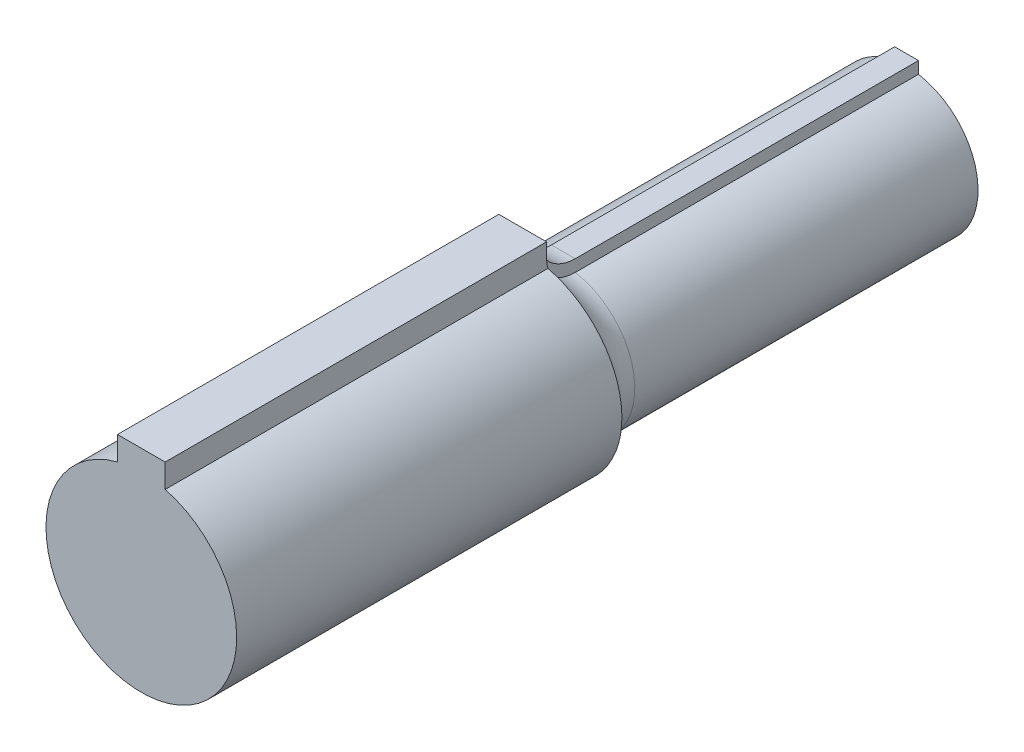
ISO-10303-21;
HEADER;
FILE_DESCRIPTION(('STEP AP214'),'2;1');
FILE_NAME('part.step','',(''),(''),'','','');
FILE_SCHEMA(('AUTOMOTIVE_DESIGN { 1 0 10303 214 1 1 1 1 }'));
ENDSEC;
DATA;
#1=APPLICATION_CONTEXT('core data for automotive mechanical design processes');
#2=APPLICATION_PROTOCOL_DEFINITION('international standard','automotive_design',2000,#1);
#3=PRODUCT_CONTEXT('',#1,'mechanical');
#4=PRODUCT('Part','Part','',(#3));
#5=PRODUCT_RELATED_PRODUCT_CATEGORY('part','',(#4));
#6=PRODUCT_DEFINITION_FORMATION('','',#4);
#7=PRODUCT_DEFINITION_CONTEXT('part definition',#1,'design');
#8=PRODUCT_DEFINITION('design','',#6,#7);
#9=PRODUCT_DEFINITION_SHAPE('','',#8);
#10=(LENGTH_UNIT() NAMED_UNIT(*) SI_UNIT(.MILLI.,.METRE.));
#11=(NAMED_UNIT(*) PLANE_ANGLE_UNIT() SI_UNIT($,.RADIAN.));
#12=(NAMED_UNIT(*) SI_UNIT($,.STERADIAN.) SOLID_ANGLE_UNIT());
#13=UNCERTAINTY_MEASURE_WITH_UNIT(LENGTH_MEASURE(1.E-05),#10,'distance_accuracy_value','');
#14=(GEOMETRIC_REPRESENTATION_CONTEXT(3) GLOBAL_UNCERTAINTY_ASSIGNED_CONTEXT((#13)) GLOBAL_UNIT_ASSIGNED_CONTEXT((#10,
#11,#12)) REPRESENTATION_CONTEXT('',''));
#15=CARTESIAN_POINT('',(0.,0.,0.));
#16=DIRECTION('',(0.,0.,1.));
#17=DIRECTION('',(1.,0.,0.));
#18=AXIS2_PLACEMENT_3D('',#15,#16,#17);
#19=CARTESIAN_POINT('',(0.,10.2462608648852,22.86));
#20=DIRECTION('',(1.,0.,0.));
#21=DIRECTION('',(0.,0.,-1.));
#22=AXIS2_PLACEMENT_3D('',#19,#20,#21);
#23=CYLINDRICAL_SURFACE('',#22,2.54);
#24=DIRECTION('',(-1.,0.,0.));
#25=VECTOR('',#24,1.);
#26=CARTESIAN_POINT('',(0.,10.2462608648852,25.4));
#27=LINE('',#26,#25);
#28=CARTESIAN_POINT('',(-0.846180210721024,10.2462608648852,25.4));
#29=VERTEX_POINT('',#28);
#30=CARTESIAN_POINT('',(-2.43368021072102,10.2462608648852,25.4));
#31=VERTEX_POINT('',#30);
#32=EDGE_CURVE('E335',#29,#31,#27,.T.);
#33=ORIENTED_EDGE('',*,*,#32,.F.);
#34=CARTESIAN_POINT('',(-0.846180210721024,10.2462608648852,22.86));
#35=DIRECTION('',(1.,0.,0.));
#36=DIRECTION('',(0.,0.,-1.));
#37=AXIS2_PLACEMENT_3D('',#34,#35,#36);
#38=CIRCLE('',#37,2.54);
#39=CARTESIAN_POINT('',(-0.846180210721024,7.70626086488517,22.86));
#40=VERTEX_POINT('',#39);
#41=EDGE_CURVE('E69',#29,#40,#38,.T.);
#42=ORIENTED_EDGE('',*,*,#41,.T.);
#43=DIRECTION('',(-1.,0.,0.));
#44=VECTOR('',#43,1.);
#45=CARTESIAN_POINT('',(0.,7.70626086488517,22.86));
#46=LINE('',#45,#44);
#47=CARTESIAN_POINT('',(-2.43368021072102,7.70626086488517,22.86));
#48=VERTEX_POINT('',#47);
#49=EDGE_CURVE('E342',#48,#40,#46,.F.);
#50=ORIENTED_EDGE('',*,*,#49,.F.);
#51=CARTESIAN_POINT('',(-2.43368021072102,10.2462608648852,22.86));
#52=DIRECTION('',(1.,0.,0.));
#53=DIRECTION('',(0.,0.,-1.));
#54=AXIS2_PLACEMENT_3D('',#51,#52,#53);
#55=CIRCLE('',#54,2.54);
#56=EDGE_CURVE('E12',#48,#31,#55,.F.);
#57=ORIENTED_EDGE('',*,*,#56,.T.);
#58=EDGE_LOOP('',(#33,#42,#50,#57));
#59=FACE_BOUND('',#58,.T.);
#60=ADVANCED_FACE('F62',(#59),#23,.F.);
#61=CARTESIAN_POINT('',(-1.63993021072102,2.21636918130267,22.86));
#62=DIRECTION('',(0.,0.,1.));
#63=DIRECTION('',(1.,0.,0.));
#64=AXIS2_PLACEMENT_3D('',#61,#62,#63);
#65=TOROIDAL_SURFACE('',#64,7.3025,2.54);
#66=CARTESIAN_POINT('',(-0.846180210721024,9.47560241818795,25.4));
#67=CARTESIAN_POINT('',(-0.846180210721024,9.40326222978175,25.400006846547));
#68=CARTESIAN_POINT('',(-0.846180210721024,9.33092566303359,25.3969461791067));
#69=CARTESIAN_POINT('',(-0.846180210721024,9.18676751178136,25.3847487458735));
#70=CARTESIAN_POINT('',(-0.846180210721024,9.11494591950044,25.3756120720333));
#71=CARTESIAN_POINT('',(-0.846180210721024,8.97219484522662,25.3512996856388));
#72=CARTESIAN_POINT('',(-0.846180210721024,8.90126720222306,25.336113129866));
#73=CARTESIAN_POINT('',(-0.846180210721024,8.76096304550298,25.2998263911218));
#74=CARTESIAN_POINT('',(-0.846180210721024,8.6915864530227,25.2787265091742));
#75=CARTESIAN_POINT('',(-0.846180210721024,8.48644325423136,25.206735877594));
#76=CARTESIAN_POINT('',(-0.846180210721024,8.3536251681889,25.1471476184895));
#77=CARTESIAN_POINT('',(-0.846180210721024,8.10026934510991,25.0066546895172));
#78=CARTESIAN_POINT('',(-0.846180210721024,7.97969564988241,24.9258150952337));
#79=CARTESIAN_POINT('',(-0.846180210721024,7.83917884792829,24.8133718491464));
#80=CARTESIAN_POINT('',(-0.846180210721024,7.81191820683588,24.790611718956));
#81=CARTESIAN_POINT('',(-0.846180210721024,7.75835869888151,24.743978297783));
#82=CARTESIAN_POINT('',(-0.846180210721024,7.73205999694367,24.7201048174982));
#83=CARTESIAN_POINT('',(-0.846180210721024,7.60268928950028,24.5976483937792));
#84=CARTESIAN_POINT('',(-0.846180210721024,7.50716903653818,24.4907996836068));
#85=CARTESIAN_POINT('',(-0.846180210721024,7.33521210962671,24.2624731211204));
#86=CARTESIAN_POINT('',(-0.846180210721024,7.25881608837566,24.1409649053352));
#87=CARTESIAN_POINT('',(-0.846180210721024,7.12759391604027,23.8868451321148));
#88=CARTESIAN_POINT('',(-0.846180210721024,7.07276051566453,23.7542373245466));
#89=CARTESIAN_POINT('',(-0.846180210721024,6.98639699050966,23.4816307991358));
#90=CARTESIAN_POINT('',(-0.846180210721024,6.95485507646525,23.3416358588811));
#91=CARTESIAN_POINT('',(-0.846180210721024,6.92583917185543,23.1299721514643));
#92=CARTESIAN_POINT('',(-0.846180210721024,6.91920655735738,23.0594453436232));
#93=CARTESIAN_POINT('',(-0.846180210721024,6.91193187953819,22.918063317032));
#94=CARTESIAN_POINT('',(-0.846180210721024,6.91128987802392,22.8472080949011));
#95=CARTESIAN_POINT('',(-0.846180210721024,6.91601606320541,22.7056042101601));
#96=CARTESIAN_POINT('',(-0.846180210721024,6.92139264379475,22.6348558345134));
#97=CARTESIAN_POINT('',(-0.846180210721024,6.93811456866048,22.4940641013245));
#98=CARTESIAN_POINT('',(-0.846180210721024,6.94946024362236,22.4240207830613));
#99=CARTESIAN_POINT('',(-0.846180210721024,6.9637627058886,22.3545834979553));
#100=B_SPLINE_CURVE_WITH_KNOTS('',3,(#66,#67,#68,#69,#70,#71,#72,#73,#74,#75,#76,#77,#78,#79,
#80,#81,#82,#83,#84,#85,#86,#87,#88,#89,#90,#91,#92,#93,#94,#95,#96,#97,#98,#99),.UNSPECIFIED.,
.F.,.F.,(4,2,2,2,2,2,2,2,2,2,2,2,2,2,2,2,4),(0.,0.216949525015699,0.433895766848428,
0.651232604080359,0.868558379564901,1.30309557344126,1.73631732665313,1.84283730800642,
1.94937546737803,2.37707687142924,2.80567987122224,3.23413865246783,3.66238041522558,
3.8746860308302,4.0869938368507,4.29959811001769,4.51221416261837),.UNSPECIFIED.);
#101=CARTESIAN_POINT('',(-0.846180210721024,9.47560241818795,25.4));
#102=VERTEX_POINT('',#101);
#103=CARTESIAN_POINT('',(-0.846180210721024,6.91251086488517,22.895622804429));
#104=VERTEX_POINT('',#103);
#105=EDGE_CURVE('E262',#102,#104,#100,.T.);
#106=ORIENTED_EDGE('',*,*,#105,.F.);
#107=CARTESIAN_POINT('',(-1.63993021072102,2.21636918130267,25.4));
#108=DIRECTION('',(0.,0.,1.));
#109=DIRECTION('',(1.,0.,0.));
#110=AXIS2_PLACEMENT_3D('',#107,#108,#109);
#111=CIRCLE('',#110,7.3025);
#112=CARTESIAN_POINT('',(-0.218450463733567,9.37918298447419,25.4));
#113=VERTEX_POINT('',#112);
#114=EDGE_CURVE('E224',#113,#102,#111,.T.);
#115=ORIENTED_EDGE('',*,*,#114,.F.);
#116=CARTESIAN_POINT('',(-0.218450463733567,8.68001852745629,25.3060599016359));
#117=CARTESIAN_POINT('',(-0.218450463733567,8.75186836478236,25.3257004916902));
#118=CARTESIAN_POINT('',(-0.218450463733567,8.82454573333397,25.3423127122161));
#119=CARTESIAN_POINT('',(-0.218450463733567,8.97052429590403,25.3692854598318));
#120=CARTESIAN_POINT('',(-0.218450463733567,9.04381754655987,25.3796889912032));
#121=CARTESIAN_POINT('',(-0.218450463733567,9.1910219238035,25.3943275841822));
#122=CARTESIAN_POINT('',(-0.218450463733567,9.26493307997519,25.3985623487226));
#123=CARTESIAN_POINT('',(-0.218450463733567,9.41337222073122,25.4008308099604));
#124=CARTESIAN_POINT('',(-0.218450463733567,9.48790087648326,25.3988205212839));
#125=CARTESIAN_POINT('',(-0.218450463733567,9.56221220973656,25.3936414864066));
#126=B_SPLINE_CURVE_WITH_KNOTS('',3,(#116,#117,#118,#119,#120,#121,#122,#123,#124,#125),
.UNSPECIFIED.,.F.,.F.,(4,2,2,2,4),(0.,0.223391741251168,0.445217646065455,0.66705423292091,
0.890456800378863),.UNSPECIFIED.);
#127=CARTESIAN_POINT('',(-0.218450463733569,8.68001852745629,25.3060599016359));
#128=VERTEX_POINT('',#127);
#129=EDGE_CURVE('E288',#128,#113,#126,.T.);
#130=ORIENTED_EDGE('',*,*,#129,.F.);
#131=CARTESIAN_POINT('',(-3.39345046373357,8.68001852745629,25.3268425309611));
#132=CARTESIAN_POINT('',(-3.5663652041885,8.63539197305506,25.3273782665881));
#133=CARTESIAN_POINT('',(-3.73738482923298,8.5834355136567,25.3278153857896));
#134=CARTESIAN_POINT('',(-4.07443679187433,8.46531500251888,25.3284942421895));
#135=CARTESIAN_POINT('',(-4.24046936782141,8.39915163101779,25.3287359887398));
#136=CARTESIAN_POINT('',(-4.56625235912862,8.25311652473432,25.3290258996383));
#137=CARTESIAN_POINT('',(-4.72600711050265,8.17325446353112,25.3290742000098));
#138=CARTESIAN_POINT('',(-5.0382230119827,8.00036403981415,25.3289778494862));
#139=CARTESIAN_POINT('',(-5.19068425074763,7.90733583740058,25.3288332009372));
#140=CARTESIAN_POINT('',(-5.48727393613483,7.70874341408532,25.3283499360388));
#141=CARTESIAN_POINT('',(-5.63139998953604,7.60317561909161,25.3280112642824));
#142=CARTESIAN_POINT('',(-5.91029942710725,7.38023487189515,25.3271375194357));
#143=CARTESIAN_POINT('',(-6.04506933617021,7.26285757257337,25.3266023738292));
#144=CARTESIAN_POINT('',(-6.30416594132857,7.01723491136424,25.3253326878894));
#145=CARTESIAN_POINT('',(-6.42849850106415,6.88899573407972,25.3245982605063));
#146=CARTESIAN_POINT('',(-6.66596614558363,6.62245421661272,25.3229252246666));
#147=CARTESIAN_POINT('',(-6.77909708068453,6.48414817980241,25.3219865409511));
#148=CARTESIAN_POINT('',(-6.99326847195629,6.19854721155934,25.3199004086027));
#149=CARTESIAN_POINT('',(-7.0943130357603,6.05125535986053,25.3187530312318));
#150=CARTESIAN_POINT('',(-7.28367375149623,5.74863104778524,25.3162432629781));
#151=CARTESIAN_POINT('',(-7.37198518960849,5.59329563844914,25.3148807928567));
#152=CARTESIAN_POINT('',(-7.53518980893602,5.27577364984992,25.3119357377617));
#153=CARTESIAN_POINT('',(-7.61008590029152,5.11358856591712,25.310353200659));
#154=CARTESIAN_POINT('',(-7.74597663415083,4.78342765402551,25.3069616486209));
#155=CARTESIAN_POINT('',(-7.80696613257952,4.61544970964158,25.3051525502623));
#156=CARTESIAN_POINT('',(-7.91455457749421,4.27501934982888,25.3013041618175));
#157=CARTESIAN_POINT('',(-7.96115895501897,4.10256864979146,25.2992649590044));
#158=CARTESIAN_POINT('',(-8.03969243670784,3.75429355969916,25.2949511620688));
#159=CARTESIAN_POINT('',(-8.07161611720036,3.57846794775921,25.2926764813305));
#160=CARTESIAN_POINT('',(-8.12052548668725,3.22483104343309,25.2878909905626));
#161=CARTESIAN_POINT('',(-8.13751761752255,3.04702064089806,25.285380282879));
#162=CARTESIAN_POINT('',(-8.15647268295334,2.69054138360564,25.2801206164837));
#163=CARTESIAN_POINT('',(-8.15843006651882,2.51187223614795,25.277371570153));
#164=CARTESIAN_POINT('',(-8.14728297487255,2.15504134832359,25.2716383383527));
#165=CARTESIAN_POINT('',(-8.13418234494483,1.97687949005793,25.2686542130952));
#166=CARTESIAN_POINT('',(-8.09303615492024,1.62227609520625,25.2624553462062));
#167=CARTESIAN_POINT('',(-8.06498507896358,1.44583521804519,25.2592405198382));
#168=CARTESIAN_POINT('',(-7.95864922163771,0.921116917873215,25.2492624695299));
#169=CARTESIAN_POINT('',(-7.85816959259067,0.577063839020376,25.2421596288558));
#170=CARTESIAN_POINT('',(-7.60091442583265,-0.0891453804779807,25.2271706891647));
#171=CARTESIAN_POINT('',(-7.44412931852323,-0.411297787840908,25.2192844571686));
#172=CARTESIAN_POINT('',(-7.07869828356537,-1.02474718084274,25.2029026843292));
#173=CARTESIAN_POINT('',(-6.87005259079005,-1.31604430621464,25.1944071462455));
#174=CARTESIAN_POINT('',(-6.40677605298402,-1.85952249905149,25.1770551581934));
#175=CARTESIAN_POINT('',(-6.15213442748477,-2.11169437057651,25.1681986239928));
#176=CARTESIAN_POINT('',(-5.60412352494051,-2.56970458112569,25.1504456900315));
#177=CARTESIAN_POINT('',(-5.310754134006,-2.77554278388829,25.1415492901536));
#178=CARTESIAN_POINT('',(-4.69356660925987,-3.1350645059231,25.1240936308432));
#179=CARTESIAN_POINT('',(-4.36974417981224,-3.28874065320046,25.115534419216));
#180=CARTESIAN_POINT('',(-3.70087287658419,-3.53953179884754,25.0991702972447));
#181=CARTESIAN_POINT('',(-3.35582401759848,-3.63664683663956,25.0913653863749));
#182=CARTESIAN_POINT('',(-2.65434816994854,-3.77153753972526,25.0769336065982));
#183=CARTESIAN_POINT('',(-2.29792298623102,-3.80932257092735,25.0703065519));
#184=CARTESIAN_POINT('',(-1.58376343245023,-3.82449665489135,25.05861992911));
#185=CARTESIAN_POINT('',(-1.22602906611449,-3.80188587948027,25.0535603565587));
#186=CARTESIAN_POINT('',(-0.519592355060622,-3.69692483937167,25.0453291358476));
#187=CARTESIAN_POINT('',(-0.170885641883444,-3.61460404977391,25.0421565576025));
#188=CARTESIAN_POINT('',(0.507770241727259,-3.39258609840363,25.0379037502525));
#189=CARTESIAN_POINT('',(0.837719476095915,-3.25288913221197,25.0368235140153));
#190=CARTESIAN_POINT('',(1.46932850210513,-2.92016741020312,25.0368278620016));
#191=CARTESIAN_POINT('',(1.77100198041303,-2.7271686351404,25.037911393145));
#192=CARTESIAN_POINT('',(2.33767807425227,-2.29329694041088,25.0421685041509));
#193=CARTESIAN_POINT('',(2.60268069459254,-2.05242402702219,25.0453420837394));
#194=CARTESIAN_POINT('',(3.0884949728718,-1.52965090444797,25.0535710668494));
#195=CARTESIAN_POINT('',(3.30930748708481,-1.24775149041796,25.0586264339018));
#196=CARTESIAN_POINT('',(3.70049654718955,-0.650929248636528,25.0703013708814));
#197=CARTESIAN_POINT('',(3.87087304431769,-0.336006388957103,25.0769209423208));
#198=CARTESIAN_POINT('',(4.15643571278584,0.318101198603731,25.0913383180617));
#199=CARTESIAN_POINT('',(4.27159625062027,0.657297111215704,25.0991366673948));
#200=CARTESIAN_POINT('',(4.44336796424018,1.3501389337436,25.1154861806647));
#201=CARTESIAN_POINT('',(4.49997861769868,1.7037849725407,25.1240373513167));
#202=CARTESIAN_POINT('',(4.55301742435167,2.41592803474273,25.1414876278541));
#203=CARTESIAN_POINT('',(4.54941459048746,2.77442746097456,25.1503869105346));
#204=CARTESIAN_POINT('',(4.49900910214807,3.30755958920097,25.1636987329379));
#205=CARTESIAN_POINT('',(4.47468238710458,3.48459278574848,25.1681321478498));
#206=CARTESIAN_POINT('',(4.41121055216329,3.83596570866249,25.1769479816203));
#207=CARTESIAN_POINT('',(4.37207090433745,4.01030640494716,25.1813304186954));
#208=CARTESIAN_POINT('',(4.27921896752572,4.35515198822553,25.1900087396487));
#209=CARTESIAN_POINT('',(4.22549891469132,4.52565477905964,25.1943045761003));
#210=CARTESIAN_POINT('',(4.1039010331219,4.86147020928021,25.2027727028856));
#211=CARTESIAN_POINT('',(4.03602843657021,5.02678474084838,25.2069450382286));
#212=CARTESIAN_POINT('',(3.88656235659111,5.35117982592529,25.2151405332262));
#213=CARTESIAN_POINT('',(3.80496295968641,5.5102576561009,25.2191636276728));
#214=CARTESIAN_POINT('',(3.62867628217648,5.82091515209454,25.2270328788433));
#215=CARTESIAN_POINT('',(3.53399384681666,5.97249756571655,25.2308791003717));
#216=CARTESIAN_POINT('',(3.33216146208088,6.26719092760832,25.2383772934084));
#217=CARTESIAN_POINT('',(3.22500792914792,6.41029942299483,25.2420292086414));
#218=CARTESIAN_POINT('',(2.99905883951992,6.686927349704,25.2491205474842));
#219=CARTESIAN_POINT('',(2.88026759885459,6.82045030438201,25.2525600491051));
#220=CARTESIAN_POINT('',(2.63182704408988,7.07704284688035,25.2592170129321));
#221=CARTESIAN_POINT('',(2.50217538440315,7.20011016491624,25.2624344268975));
#222=CARTESIAN_POINT('',(2.23300798894234,7.43483909224692,25.2686371522347));
#223=CARTESIAN_POINT('',(2.09349591551847,7.54650489900408,25.2716225489262));
#224=CARTESIAN_POINT('',(1.80554007423853,7.75769996499646,25.2773580682288));
#225=CARTESIAN_POINT('',(1.65709527553051,7.85722781946425,25.2801081635968));
#226=CARTESIAN_POINT('',(1.35240052583534,8.04338868329605,25.2853697391502));
#227=CARTESIAN_POINT('',(1.19615347735491,8.13002644085886,25.2878813070758));
#228=CARTESIAN_POINT('',(0.87682381139365,8.28987951342235,25.2926687519051));
#229=CARTESIAN_POINT('',(0.7137373837562,8.36308722127245,25.2949444949154));
#230=CARTESIAN_POINT('',(0.382033463744578,8.4954736357896,25.2992602393291));
#231=CARTESIAN_POINT('',(0.213418037653242,8.55465751689012,25.3013003275402));
#232=CARTESIAN_POINT('',(-0.128121448264139,8.65858459588343,25.3051486864449));
#233=CARTESIAN_POINT('',(-0.30104343895942,8.7033345898025,25.3069570659934));
#234=CARTESIAN_POINT('',(-0.650045830358699,8.77811551974275,25.3103480436612));
#235=CARTESIAN_POINT('',(-0.82612626864236,8.80814628051181,25.311930639092));
#236=CARTESIAN_POINT('',(-1.1803179197024,8.85328393184924,25.3148765833091));
#237=CARTESIAN_POINT('',(-1.35843048059311,8.86838025311936,25.3162397762509));
#238=CARTESIAN_POINT('',(-1.71530392501844,8.88352706607223,25.3187513242693));
#239=CARTESIAN_POINT('',(-1.89406483951696,8.88357682944611,25.3198996689437));
#240=CARTESIAN_POINT('',(-2.07251124301319,8.87606014416662,25.3209434048136));
#241=B_SPLINE_CURVE_WITH_KNOTS('',3,(#131,#132,#133,#134,#135,#136,#137,#138,#139,#140,#141,
#142,#143,#144,#145,#146,#147,#148,#149,#150,#151,#152,#153,#154,#155,#156,#157,#158,#159,#160,
#161,#162,#163,#164,#165,#166,#167,#168,#169,#170,#171,#172,#173,#174,#175,#176,#177,#178,#179,
#180,#181,#182,#183,#184,#185,#186,#187,#188,#189,#190,#191,#192,#193,#194,#195,#196,#197,#198,
#199,#200,#201,#202,#203,#204,#205,#206,#207,#208,#209,#210,#211,#212,#213,#214,#215,#216,#217,
#218,#219,#220,#221,#222,#223,#224,#225,#226,#227,#228,#229,#230,#231,#232,#233,#234,#235,#236,
#237,#238,#239,#240),.UNSPECIFIED.,.F.,.F.,(4,2,2,2,2,2,2,2,2,2,2,2,2,2,2,2,2,2,2,2,2,2,2,2,2,2,
2,2,2,2,2,2,2,2,2,2,2,2,2,2,2,2,2,2,2,2,2,2,2,2,2,2,2,2,4),(0.,0.535580741661966,
1.07113584500334,1.60631430172069,2.14148625123017,2.67681110557873,3.2123337408534,
3.74755348076515,4.2829707587419,4.81820555146933,5.35363798284662,5.88895412386207,
6.4244679592589,6.95977936577671,7.49528838044692,8.03056624965547,8.56604174112561,
9.10138052147002,9.63691694807922,10.7068634808426,11.7769919463134,12.8471155653323,
13.917490324789,14.9878682320436,16.0583973514779,17.1289257247676,18.1992850861249,
19.2696414022962,20.3394697097718,21.4092943705039,22.4785984870796,23.5479024634293,
24.6171857178127,25.6864700060193,26.7562502202172,27.8260399779053,28.8963802876338,
29.4321148627191,29.9676517240065,30.5034743120646,31.0390991570766,31.5749553418713,
32.110613603953,32.6464261686827,33.1820407656526,33.7177713421388,34.2533039730235,
34.7888985242635,35.3242952927028,35.8599943945371,36.395495528237,36.9307441582078,
37.4659991608737,38.0016327000944,38.5372921659486),.UNSPECIFIED.);
#242=CARTESIAN_POINT('',(-3.39345046373357,8.68001852745629,25.3268425309611));
#243=VERTEX_POINT('',#242);
#244=EDGE_CURVE('E281',#243,#128,#241,.T.);
#245=ORIENTED_EDGE('',*,*,#244,.F.);
#246=CARTESIAN_POINT('',(-3.39345046373357,9.30521062206538,25.4));
#247=CARTESIAN_POINT('',(-3.39345046373357,9.22836572266258,25.4000067452922));
#248=CARTESIAN_POINT('',(-3.39345046373357,9.15152515611351,25.3967138669819));
#249=CARTESIAN_POINT('',(-3.39345046373357,8.99894228435684,25.3836641728465));
#250=CARTESIAN_POINT('',(-3.39345046373357,8.92319605524412,25.3739532594154));
#251=CARTESIAN_POINT('',(-3.39345046373357,8.77255957311093,25.3481608580971));
#252=CARTESIAN_POINT('',(-3.39345046373357,8.69767262905279,25.3320600609201));
#253=CARTESIAN_POINT('',(-3.39345046373357,8.54944907600883,25.2936143954906));
#254=CARTESIAN_POINT('',(-3.39345046373357,8.47611387898606,25.2712640830848));
#255=CARTESIAN_POINT('',(-3.39345046373357,8.4038500506012,25.2458662243604));
#256=B_SPLINE_CURVE_WITH_KNOTS('',3,(#246,#247,#248,#249,#250,#251,#252,#253,#254,#255),
.UNSPECIFIED.,.F.,.F.,(4,2,2,2,4),(0.,0.230457689754817,0.459284706967418,0.688808536182228,
0.918532937257179),.UNSPECIFIED.);
#257=CARTESIAN_POINT('',(-3.39345046373357,9.30521062206538,25.4));
#258=VERTEX_POINT('',#257);
#259=EDGE_CURVE('E160',#258,#243,#256,.T.);
#260=ORIENTED_EDGE('',*,*,#259,.F.);
#261=CARTESIAN_POINT('',(-2.43368021072102,9.47560241818795,25.4));
#262=VERTEX_POINT('',#261);
#263=EDGE_CURVE('E204',#262,#258,#111,.T.);
#264=ORIENTED_EDGE('',*,*,#263,.F.);
#265=CARTESIAN_POINT('',(-2.43368021072102,6.91251086488517,22.8956228044062));
#266=CARTESIAN_POINT('',(-2.43368021072102,6.91351073524169,22.9664621726043));
#267=CARTESIAN_POINT('',(-2.43368021072102,6.91753192960868,23.0372547261233));
#268=CARTESIAN_POINT('',(-2.43368021072102,6.93154838061704,23.1782396768464));
#269=CARTESIAN_POINT('',(-2.43368021072102,6.94154309340771,23.248432128096));
#270=CARTESIAN_POINT('',(-2.43368021072102,6.96742223916492,23.3876375595289));
#271=CARTESIAN_POINT('',(-2.43368021072102,6.98329939544057,23.4566518871973));
#272=CARTESIAN_POINT('',(-2.43368021072102,7.02080322509746,23.5930799138459));
#273=CARTESIAN_POINT('',(-2.43368021072102,7.04242988143166,23.6604936175713));
#274=CARTESIAN_POINT('',(-2.43368021072102,7.11572289819174,23.8596589168817));
#275=CARTESIAN_POINT('',(-2.43368021072102,7.1758186035008,23.9884217127391));
#276=CARTESIAN_POINT('',(-2.43368021072102,7.3165724152236,24.2340616575246));
#277=CARTESIAN_POINT('',(-2.43368021072102,7.39723004202501,24.3509390835932));
#278=CARTESIAN_POINT('',(-2.43368021072102,7.5774801560365,24.5706129127373));
#279=CARTESIAN_POINT('',(-2.43368021072102,7.67721611972269,24.6732917503043));
#280=CARTESIAN_POINT('',(-2.43368021072102,7.89236491531275,24.8606922696378));
#281=CARTESIAN_POINT('',(-2.43368021072102,8.00778180678652,24.9454092867532));
#282=CARTESIAN_POINT('',(-2.43368021072102,8.2528830363427,25.0957114393868));
#283=CARTESIAN_POINT('',(-2.43368021072102,8.38275747068794,25.1609864050864));
#284=CARTESIAN_POINT('',(-2.43368021072102,8.65158538562664,25.2687866441003));
#285=CARTESIAN_POINT('',(-2.43368021072102,8.7905330684063,25.3113262887207));
#286=CARTESIAN_POINT('',(-2.43368021072102,9.02128992392811,25.3612100896507));
#287=CARTESIAN_POINT('',(-2.43368021072102,9.1116073484945,25.3757468303052));
#288=CARTESIAN_POINT('',(-2.43368021072102,9.29313742949249,25.395138813211));
#289=CARTESIAN_POINT('',(-2.43368021072102,9.3843485300362,25.4000086261539));
#290=CARTESIAN_POINT('',(-2.43368021072102,9.47560241818795,25.4));
#291=B_SPLINE_CURVE_WITH_KNOTS('',3,(#265,#266,#267,#268,#269,#270,#271,#272,#273,#274,#275,
#276,#277,#278,#279,#280,#281,#282,#283,#284,#285,#286,#287,#288,#289,#290),.UNSPECIFIED.,.F.,
.F.,(4,2,2,2,2,2,2,2,2,2,2,2,4),(0.,0.212468427277733,0.42491751360829,0.637104669215143,
0.84929119570208,1.27340201604693,1.69750294479814,2.12492846097572,2.55246484316252,
2.98649568544574,3.42025184545204,3.69421383919892,3.96776258314574),.UNSPECIFIED.);
#292=CARTESIAN_POINT('',(-2.43368021072102,6.91251086488517,22.8956228044062));
#293=VERTEX_POINT('',#292);
#294=EDGE_CURVE('E239',#293,#262,#291,.T.);
#295=ORIENTED_EDGE('',*,*,#294,.F.);
#296=CARTESIAN_POINT('',(-2.4321798795243,6.91251086488517,22.86));
#297=CARTESIAN_POINT('',(-2.43216599048992,6.91251086488517,22.8747516720813));
#298=CARTESIAN_POINT('',(-2.4329521495575,6.91251086488517,22.8894946517307));
#299=CARTESIAN_POINT('',(-2.43600335724353,6.91251086488517,22.9186975227596));
#300=CARTESIAN_POINT('',(-2.43825537315546,6.91251086488517,22.9331587629368));
#301=CARTESIAN_POINT('',(-2.44411959482915,6.91251086488517,22.9617905376562));
#302=CARTESIAN_POINT('',(-2.44773128055938,6.91251086488517,22.9759611811604));
#303=CARTESIAN_POINT('',(-2.4561817748063,6.91251086488517,23.0040709719515));
#304=CARTESIAN_POINT('',(-2.46103117025112,6.91251086488517,23.0180069565653));
#305=CARTESIAN_POINT('',(-2.46639859191292,6.91251086488517,23.0317258916605));
#306=B_SPLINE_CURVE_WITH_KNOTS('',3,(#296,#297,#298,#299,#300,#301,#302,#303,#304,#305),
.UNSPECIFIED.,.F.,.F.,(4,2,2,2,4),(0.,0.0442205021931416,0.0880531200931276,0.131868990380918,
0.176072999066531),.UNSPECIFIED.);
#307=CARTESIAN_POINT('',(-2.4321798795243,6.91251086488517,22.86));
#308=VERTEX_POINT('',#307);
#309=EDGE_CURVE('E231',#308,#293,#306,.T.);
#310=ORIENTED_EDGE('',*,*,#309,.F.);
#311=CARTESIAN_POINT('',(-1.63993021072102,2.21636918130267,22.86));
#312=DIRECTION('',(0.,0.,1.));
#313=DIRECTION('',(1.,0.,0.));
#314=AXIS2_PLACEMENT_3D('',#311,#312,#313);
#315=CIRCLE('',#314,4.7625);
#316=CARTESIAN_POINT('',(-0.84768054191775,6.91251086488517,22.86));
#317=VERTEX_POINT('',#316);
#318=EDGE_CURVE('E227',#317,#308,#315,.F.);
#319=ORIENTED_EDGE('',*,*,#318,.F.);
#320=CARTESIAN_POINT('',(-0.846180210719093,6.91251086488517,22.895622804429));
#321=CARTESIAN_POINT('',(-0.848316750277567,6.91251086488517,22.8688723276795));
#322=CARTESIAN_POINT('',(-0.84805760755174,6.91251086488517,22.842363991511));
#323=CARTESIAN_POINT('',(-0.842747962460871,6.91251086488517,22.7898316491064));
#324=CARTESIAN_POINT('',(-0.837697468992263,6.91251086488517,22.7638076419711));
#325=CARTESIAN_POINT('',(-0.830251302135787,6.91251086488517,22.7380257745176));
#326=B_SPLINE_CURVE_WITH_KNOTS('',3,(#320,#321,#322,#323,#324,#325),.UNSPECIFIED.,.F.,.F.,(4,2,
4),(0.,0.079528808442894,0.159057469219416),.UNSPECIFIED.);
#327=EDGE_CURVE('E269',#104,#317,#326,.T.);
#328=ORIENTED_EDGE('',*,*,#327,.F.);
#329=EDGE_LOOP('',(#106,#115,#130,#245,#260,#264,#295,#310,#319,#328));
#330=FACE_BOUND('',#329,.T.);
#331=ADVANCED_FACE('F249',(#330),#65,.F.);
#332=CARTESIAN_POINT('',(-1.63993021072102,2.21636918130267,25.4));
#333=DIRECTION('',(0.,0.,-1.));
#334=DIRECTION('',(-1.,0.,0.));
#335=AXIS2_PLACEMENT_3D('',#332,#333,#334);
#336=CYLINDRICAL_SURFACE('',#335,4.7625);
#337=DIRECTION('',(0.,0.,-1.));
#338=VECTOR('',#337,1.);
#339=CARTESIAN_POINT('',(-0.84768054191775,6.91251086488517,25.4));
#340=LINE('',#339,#338);
#341=CARTESIAN_POINT('',(-0.84768054191775,6.91251086488517,0.));
#342=VERTEX_POINT('',#341);
#343=EDGE_CURVE('E199',#317,#342,#340,.T.);
#344=ORIENTED_EDGE('',*,*,#343,.F.);
#345=ORIENTED_EDGE('',*,*,#318,.T.);
#346=DIRECTION('',(0.,0.,-1.));
#347=VECTOR('',#346,1.);
#348=CARTESIAN_POINT('',(-2.4321798795243,6.91251086488517,25.4));
#349=LINE('',#348,#347);
#350=CARTESIAN_POINT('',(-2.4321798795243,6.91251086488517,0.));
#351=VERTEX_POINT('',#350);
#352=EDGE_CURVE('E202',#308,#351,#349,.T.);
#353=ORIENTED_EDGE('',*,*,#352,.T.);
#354=CARTESIAN_POINT('',(-1.63993021072102,2.21636918130267,0.));
#355=DIRECTION('',(0.,0.,1.));
#356=DIRECTION('',(1.,0.,0.));
#357=AXIS2_PLACEMENT_3D('',#354,#355,#356);
#358=CIRCLE('',#357,4.7625);
#359=EDGE_CURVE('E196',#351,#342,#358,.T.);
#360=ORIENTED_EDGE('',*,*,#359,.T.);
#361=EDGE_LOOP('',(#344,#345,#353,#360));
#362=FACE_BOUND('',#361,.T.);
#363=ADVANCED_FACE('F253',(#362),#336,.T.);
#364=CARTESIAN_POINT('',(0.,0.,0.));
#365=DIRECTION('',(0.,0.,1.));
#366=DIRECTION('',(1.,0.,0.));
#367=AXIS2_PLACEMENT_3D('',#364,#365,#366);
#368=PLANE('',#367);
#369=ORIENTED_EDGE('',*,*,#359,.F.);
#370=DIRECTION('',(-1.,0.,0.));
#371=VECTOR('',#370,1.);
#372=CARTESIAN_POINT('',(-0.846180210721024,6.91251086488517,0.));
#373=LINE('',#372,#371);
#374=CARTESIAN_POINT('',(-2.43368021072102,6.91251086488517,0.));
#375=VERTEX_POINT('',#374);
#376=EDGE_CURVE('E210',#351,#375,#373,.T.);
#377=ORIENTED_EDGE('',*,*,#376,.T.);
#378=DIRECTION('',(0.,-1.,0.));
#379=VECTOR('',#378,1.);
#380=CARTESIAN_POINT('',(-2.43368021072102,7.70626086488517,0.));
#381=LINE('',#380,#379);
#382=CARTESIAN_POINT('',(-2.43368021072102,7.70626086488517,0.));
#383=VERTEX_POINT('',#382);
#384=EDGE_CURVE('E207',#383,#375,#381,.T.);
#385=ORIENTED_EDGE('',*,*,#384,.F.);
#386=DIRECTION('',(-1.,0.,0.));
#387=VECTOR('',#386,1.);
#388=CARTESIAN_POINT('',(-0.846180210721024,7.70626086488517,0.));
#389=LINE('',#388,#387);
#390=CARTESIAN_POINT('',(-0.846180210721024,7.70626086488517,0.));
#391=VERTEX_POINT('',#390);
#392=EDGE_CURVE('E165',#391,#383,#389,.T.);
#393=ORIENTED_EDGE('',*,*,#392,.F.);
#394=DIRECTION('',(0.,-1.,0.));
#395=VECTOR('',#394,1.);
#396=CARTESIAN_POINT('',(-0.846180210721024,7.70626086488517,0.));
#397=LINE('',#396,#395);
#398=CARTESIAN_POINT('',(-0.846180210721024,6.91251086488517,0.));
#399=VERTEX_POINT('',#398);
#400=EDGE_CURVE('E214',#391,#399,#397,.T.);
#401=ORIENTED_EDGE('',*,*,#400,.T.);
#402=EDGE_CURVE('E211',#399,#342,#373,.T.);
#403=ORIENTED_EDGE('',*,*,#402,.T.);
#404=EDGE_LOOP('',(#369,#377,#385,#393,#401,#403));
#405=FACE_BOUND('',#404,.T.);
#406=ADVANCED_FACE('F311',(#405),#368,.F.);
#407=CARTESIAN_POINT('',(-2.43368021072102,7.70626086488517,25.4));
#408=DIRECTION('',(1.,0.,0.));
#409=DIRECTION('',(0.,0.,-1.));
#410=AXIS2_PLACEMENT_3D('',#407,#408,#409);
#411=PLANE('',#410);
#412=DIRECTION('',(0.,0.,-1.));
#413=VECTOR('',#412,1.);
#414=CARTESIAN_POINT('',(-2.43368021072102,6.91251086488517,25.4));
#415=LINE('',#414,#413);
#416=EDGE_CURVE('E221',#293,#375,#415,.T.);
#417=ORIENTED_EDGE('',*,*,#416,.F.);
#418=ORIENTED_EDGE('',*,*,#294,.T.);
#419=DIRECTION('',(0.,-1.,0.));
#420=VECTOR('',#419,1.);
#421=CARTESIAN_POINT('',(-2.43368021072102,7.70626086488517,25.4));
#422=LINE('',#421,#420);
#423=EDGE_CURVE('E340',#31,#262,#422,.T.);
#424=ORIENTED_EDGE('',*,*,#423,.F.);
#425=ORIENTED_EDGE('',*,*,#56,.F.);
#426=DIRECTION('',(0.,0.,-1.));
#427=VECTOR('',#426,1.);
#428=CARTESIAN_POINT('',(-2.43368021072102,7.70626086488517,25.4));
#429=LINE('',#428,#427);
#430=EDGE_CURVE('E200',#48,#383,#429,.T.);
#431=ORIENTED_EDGE('',*,*,#430,.T.);
#432=ORIENTED_EDGE('',*,*,#384,.T.);
#433=EDGE_LOOP('',(#417,#418,#424,#425,#431,#432));
#434=FACE_BOUND('',#433,.T.);
#435=ADVANCED_FACE('F314',(#434),#411,.F.);
#436=CARTESIAN_POINT('',(-0.846180210721024,6.91251086488517,25.4));
#437=DIRECTION('',(0.,-1.,0.));
#438=DIRECTION('',(0.,0.,-1.));
#439=AXIS2_PLACEMENT_3D('',#436,#437,#438);
#440=PLANE('',#439);
#441=ORIENTED_EDGE('',*,*,#352,.F.);
#442=ORIENTED_EDGE('',*,*,#309,.T.);
#443=ORIENTED_EDGE('',*,*,#416,.T.);
#444=ORIENTED_EDGE('',*,*,#376,.F.);
#445=EDGE_LOOP('',(#441,#442,#443,#444));
#446=FACE_BOUND('',#445,.T.);
#447=ADVANCED_FACE('F246',(#446),#440,.T.);
#448=DIRECTION('',(0.,0.,-1.));
#449=VECTOR('',#448,1.);
#450=CARTESIAN_POINT('',(-0.846180210721024,6.91251086488517,25.4));
#451=LINE('',#450,#449);
#452=EDGE_CURVE('E219',#104,#399,#451,.T.);
#453=ORIENTED_EDGE('',*,*,#452,.F.);
#454=ORIENTED_EDGE('',*,*,#327,.T.);
#455=ORIENTED_EDGE('',*,*,#343,.T.);
#456=ORIENTED_EDGE('',*,*,#402,.F.);
#457=EDGE_LOOP('',(#453,#454,#455,#456));
#458=FACE_BOUND('',#457,.T.);
#459=ADVANCED_FACE('F321',(#458),#440,.T.);
#460=CARTESIAN_POINT('',(-0.846180210721024,7.70626086488517,25.4));
#461=DIRECTION('',(1.,0.,0.));
#462=DIRECTION('',(0.,0.,-1.));
#463=AXIS2_PLACEMENT_3D('',#460,#461,#462);
#464=PLANE('',#463);
#465=DIRECTION('',(0.,0.,-1.));
#466=VECTOR('',#465,1.);
#467=CARTESIAN_POINT('',(-0.846180210721024,7.70626086488517,25.4));
#468=LINE('',#467,#466);
#469=EDGE_CURVE('E217',#40,#391,#468,.T.);
#470=ORIENTED_EDGE('',*,*,#469,.F.);
#471=ORIENTED_EDGE('',*,*,#41,.F.);
#472=DIRECTION('',(0.,1.,0.));
#473=VECTOR('',#472,1.);
#474=CARTESIAN_POINT('',(-0.846180210721024,0.,25.4));
#475=LINE('',#474,#473);
#476=EDGE_CURVE('E339',#102,#29,#475,.T.);
#477=ORIENTED_EDGE('',*,*,#476,.F.);
#478=ORIENTED_EDGE('',*,*,#105,.T.);
#479=ORIENTED_EDGE('',*,*,#452,.T.);
#480=ORIENTED_EDGE('',*,*,#400,.F.);
#481=EDGE_LOOP('',(#470,#471,#477,#478,#479,#480));
#482=FACE_BOUND('',#481,.T.);
#483=ADVANCED_FACE('F318',(#482),#464,.T.);
#484=CARTESIAN_POINT('',(-0.846180210721024,7.70626086488517,25.4));
#485=DIRECTION('',(0.,-1.,0.));
#486=DIRECTION('',(0.,0.,-1.));
#487=AXIS2_PLACEMENT_3D('',#484,#485,#486);
#488=PLANE('',#487);
#489=ORIENTED_EDGE('',*,*,#430,.F.);
#490=ORIENTED_EDGE('',*,*,#49,.T.);
#491=ORIENTED_EDGE('',*,*,#469,.T.);
#492=ORIENTED_EDGE('',*,*,#392,.T.);
#493=EDGE_LOOP('',(#489,#490,#491,#492));
#494=FACE_BOUND('',#493,.T.);
#495=ADVANCED_FACE('F255',(#494),#488,.F.);
#496=CARTESIAN_POINT('',(0.,0.,25.4));
#497=DIRECTION('',(0.,0.,1.));
#498=DIRECTION('',(1.,0.,0.));
#499=AXIS2_PLACEMENT_3D('',#496,#497,#498);
#500=PLANE('',#499);
#501=ORIENTED_EDGE('',*,*,#114,.T.);
#502=ORIENTED_EDGE('',*,*,#476,.T.);
#503=ORIENTED_EDGE('',*,*,#32,.T.);
#504=ORIENTED_EDGE('',*,*,#423,.T.);
#505=ORIENTED_EDGE('',*,*,#263,.T.);
#506=DIRECTION('',(0.,-1.,0.));
#507=VECTOR('',#506,1.);
#508=CARTESIAN_POINT('',(-3.39345046373357,10.2631935622144,25.4));
#509=LINE('',#508,#507);
#510=CARTESIAN_POINT('',(-3.39345046373357,10.2631935622144,25.4));
#511=VERTEX_POINT('',#510);
#512=EDGE_CURVE('E186',#511,#258,#509,.T.);
#513=ORIENTED_EDGE('',*,*,#512,.F.);
#514=DIRECTION('',(1.,0.,0.));
#515=VECTOR('',#514,1.);
#516=CARTESIAN_POINT('',(-3.39345046373357,10.2631935622144,25.4));
#517=LINE('',#516,#515);
#518=CARTESIAN_POINT('',(-0.218450463733567,10.2631935622144,25.4));
#519=VERTEX_POINT('',#518);
#520=EDGE_CURVE('E188',#511,#519,#517,.T.);
#521=ORIENTED_EDGE('',*,*,#520,.T.);
#522=DIRECTION('',(0.,-1.,0.));
#523=VECTOR('',#522,1.);
#524=CARTESIAN_POINT('',(-0.218450463733567,10.2631935622144,25.4));
#525=LINE('',#524,#523);
#526=EDGE_CURVE('E191',#519,#113,#525,.T.);
#527=ORIENTED_EDGE('',*,*,#526,.T.);
#528=EDGE_LOOP('',(#501,#502,#503,#504,#505,#513,#521,#527));
#529=FACE_BOUND('',#528,.T.);
#530=ADVANCED_FACE('F298',(#529),#500,.F.);
#531=CARTESIAN_POINT('',(-1.80595046373357,2.53165746535202,50.8));
#532=DIRECTION('',(0.,0.,-1.));
#533=DIRECTION('',(-1.,0.,0.));
#534=AXIS2_PLACEMENT_3D('',#531,#532,#533);
#535=CYLINDRICAL_SURFACE('',#534,6.35);
#536=DIRECTION('',(0.,0.,-1.));
#537=VECTOR('',#536,1.);
#538=CARTESIAN_POINT('',(-3.39345046373357,8.68001852745629,50.8));
#539=LINE('',#538,#537);
#540=CARTESIAN_POINT('',(-3.39345046373357,8.68001852745629,50.8));
#541=VERTEX_POINT('',#540);
#542=EDGE_CURVE('E153',#541,#243,#539,.T.);
#543=ORIENTED_EDGE('',*,*,#542,.T.);
#544=ORIENTED_EDGE('',*,*,#244,.T.);
#545=DIRECTION('',(0.,0.,-1.));
#546=VECTOR('',#545,1.);
#547=CARTESIAN_POINT('',(-0.218450463733567,8.68001852745629,50.8));
#548=LINE('',#547,#546);
#549=CARTESIAN_POINT('',(-0.218450463733567,8.68001852745629,50.8));
#550=VERTEX_POINT('',#549);
#551=EDGE_CURVE('E166',#550,#128,#548,.T.);
#552=ORIENTED_EDGE('',*,*,#551,.F.);
#553=CARTESIAN_POINT('',(-1.80595046373357,2.53165746535202,50.8));
#554=DIRECTION('',(0.,0.,1.));
#555=DIRECTION('',(1.,0.,0.));
#556=AXIS2_PLACEMENT_3D('',#553,#554,#555);
#557=CIRCLE('',#556,6.35);
#558=EDGE_CURVE('E172',#541,#550,#557,.T.);
#559=ORIENTED_EDGE('',*,*,#558,.F.);
#560=EDGE_LOOP('',(#543,#544,#552,#559));
#561=FACE_BOUND('',#560,.T.);
#562=ADVANCED_FACE('F178',(#561),#535,.T.);
#563=CARTESIAN_POINT('',(0.,0.,50.8));
#564=DIRECTION('',(0.,0.,1.));
#565=DIRECTION('',(1.,0.,0.));
#566=AXIS2_PLACEMENT_3D('',#563,#564,#565);
#567=PLANE('',#566);
#568=DIRECTION('',(0.,-1.,0.));
#569=VECTOR('',#568,1.);
#570=CARTESIAN_POINT('',(-3.39345046373357,10.2631935622144,50.8));
#571=LINE('',#570,#569);
#572=CARTESIAN_POINT('',(-3.39345046373357,10.2631935622144,50.8));
#573=VERTEX_POINT('',#572);
#574=EDGE_CURVE('E157',#573,#541,#571,.T.);
#575=ORIENTED_EDGE('',*,*,#574,.T.);
#576=ORIENTED_EDGE('',*,*,#558,.T.);
#577=DIRECTION('',(0.,-1.,0.));
#578=VECTOR('',#577,1.);
#579=CARTESIAN_POINT('',(-0.218450463733567,10.2631935622144,50.8));
#580=LINE('',#579,#578);
#581=CARTESIAN_POINT('',(-0.218450463733567,10.2631935622144,50.8));
#582=VERTEX_POINT('',#581);
#583=EDGE_CURVE('E176',#582,#550,#580,.T.);
#584=ORIENTED_EDGE('',*,*,#583,.F.);
#585=DIRECTION('',(1.,0.,0.));
#586=VECTOR('',#585,1.);
#587=CARTESIAN_POINT('',(-3.39345046373357,10.2631935622144,50.8));
#588=LINE('',#587,#586);
#589=EDGE_CURVE('E174',#573,#582,#588,.T.);
#590=ORIENTED_EDGE('',*,*,#589,.F.);
#591=EDGE_LOOP('',(#575,#576,#584,#590));
#592=FACE_BOUND('',#591,.T.);
#593=ADVANCED_FACE('F170',(#592),#567,.T.);
#594=CARTESIAN_POINT('',(-3.39345046373357,10.2631935622144,50.8));
#595=DIRECTION('',(1.,0.,0.));
#596=DIRECTION('',(0.,0.,-1.));
#597=AXIS2_PLACEMENT_3D('',#594,#595,#596);
#598=PLANE('',#597);
#599=ORIENTED_EDGE('',*,*,#512,.T.);
#600=ORIENTED_EDGE('',*,*,#259,.T.);
#601=ORIENTED_EDGE('',*,*,#542,.F.);
#602=ORIENTED_EDGE('',*,*,#574,.F.);
#603=DIRECTION('',(0.,0.,-1.));
#604=VECTOR('',#603,1.);
#605=CARTESIAN_POINT('',(-3.39345046373357,10.2631935622144,50.8));
#606=LINE('',#605,#604);
#607=EDGE_CURVE('E180',#573,#511,#606,.T.);
#608=ORIENTED_EDGE('',*,*,#607,.T.);
#609=EDGE_LOOP('',(#599,#600,#601,#602,#608));
#610=FACE_BOUND('',#609,.T.);
#611=ADVANCED_FACE('F156',(#610),#598,.F.);
#612=CARTESIAN_POINT('',(-0.218450463733567,10.2631935622144,50.8));
#613=DIRECTION('',(1.,0.,0.));
#614=DIRECTION('',(0.,0.,-1.));
#615=AXIS2_PLACEMENT_3D('',#612,#613,#614);
#616=PLANE('',#615);
#617=ORIENTED_EDGE('',*,*,#551,.T.);
#618=ORIENTED_EDGE('',*,*,#129,.T.);
#619=ORIENTED_EDGE('',*,*,#526,.F.);
#620=DIRECTION('',(0.,0.,-1.));
#621=VECTOR('',#620,1.);
#622=CARTESIAN_POINT('',(-0.218450463733567,10.2631935622144,50.8));
#623=LINE('',#622,#621);
#624=EDGE_CURVE('E175',#582,#519,#623,.T.);
#625=ORIENTED_EDGE('',*,*,#624,.F.);
#626=ORIENTED_EDGE('',*,*,#583,.T.);
#627=EDGE_LOOP('',(#617,#618,#619,#625,#626));
#628=FACE_BOUND('',#627,.T.);
#629=ADVANCED_FACE('F303',(#628),#616,.T.);
#630=CARTESIAN_POINT('',(-3.39345046373357,10.2631935622144,50.8));
#631=DIRECTION('',(0.,1.,0.));
#632=DIRECTION('',(0.,0.,1.));
#633=AXIS2_PLACEMENT_3D('',#630,#631,#632);
#634=PLANE('',#633);
#635=ORIENTED_EDGE('',*,*,#520,.F.);
#636=ORIENTED_EDGE('',*,*,#607,.F.);
#637=ORIENTED_EDGE('',*,*,#589,.T.);
#638=ORIENTED_EDGE('',*,*,#624,.T.);
#639=EDGE_LOOP('',(#635,#636,#637,#638));
#640=FACE_BOUND('',#639,.T.);
#641=ADVANCED_FACE('F299',(#640),#634,.T.);
#642=CLOSED_SHELL('',(#60,#331,#363,#406,#435,#447,#459,#483,#495,#530,#562,#593,#611,#629,#641));
#643=MANIFOLD_SOLID_BREP('B2',#642);
#644=ADVANCED_BREP_SHAPE_REPRESENTATION('',(#18,#643),#14);
#645=SHAPE_DEFINITION_REPRESENTATION(#9,#644);
ENDSEC;
END-ISO-10303-21;
